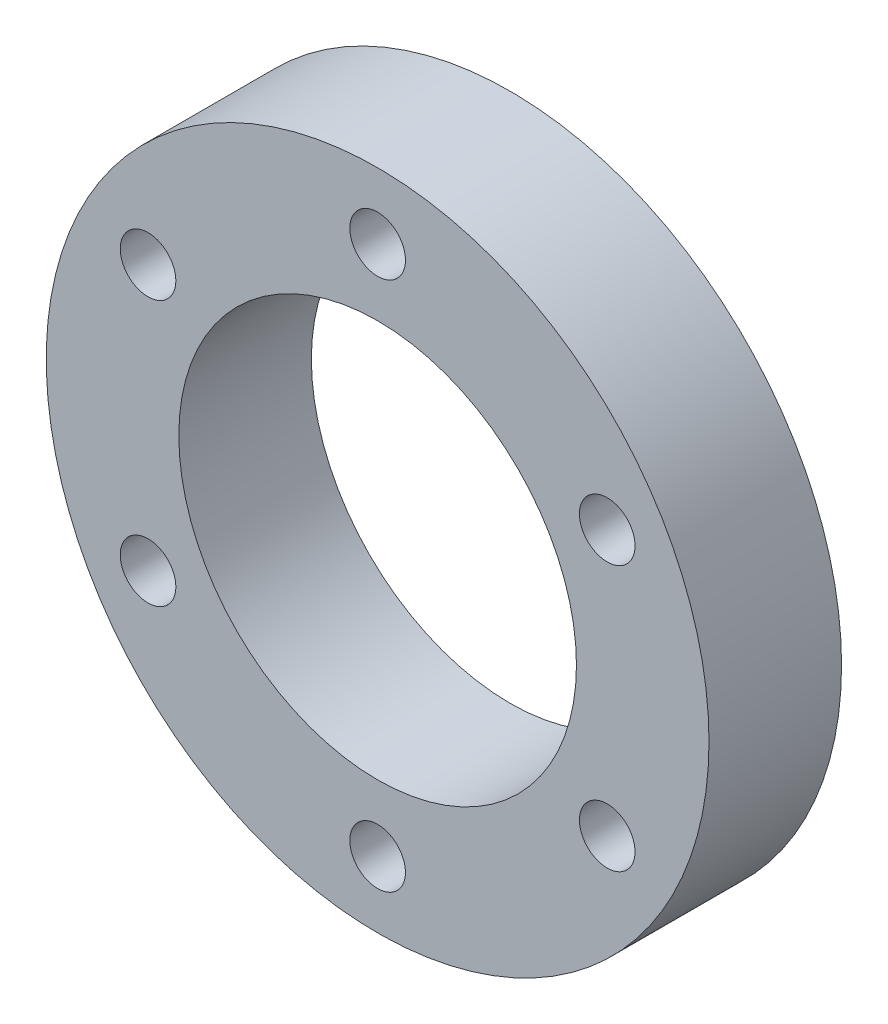
ISO-10303-21;
HEADER;
FILE_DESCRIPTION(('STEP AP214'),'2;1');
FILE_NAME('part.step','',(''),(''),'','','');
FILE_SCHEMA(('AUTOMOTIVE_DESIGN { 1 0 10303 214 1 1 1 1 }'));
ENDSEC;
DATA;
#1=APPLICATION_CONTEXT('core data for automotive mechanical design processes');
#2=APPLICATION_PROTOCOL_DEFINITION('international standard','automotive_design',2000,#1);
#3=PRODUCT_CONTEXT('',#1,'mechanical');
#4=PRODUCT('Part','Part','',(#3));
#5=PRODUCT_RELATED_PRODUCT_CATEGORY('part','',(#4));
#6=PRODUCT_DEFINITION_FORMATION('','',#4);
#7=PRODUCT_DEFINITION_CONTEXT('part definition',#1,'design');
#8=PRODUCT_DEFINITION('design','',#6,#7);
#9=PRODUCT_DEFINITION_SHAPE('','',#8);
#10=(LENGTH_UNIT() NAMED_UNIT(*) SI_UNIT(.MILLI.,.METRE.));
#11=(NAMED_UNIT(*) PLANE_ANGLE_UNIT() SI_UNIT($,.RADIAN.));
#12=(NAMED_UNIT(*) SI_UNIT($,.STERADIAN.) SOLID_ANGLE_UNIT());
#13=UNCERTAINTY_MEASURE_WITH_UNIT(LENGTH_MEASURE(1.E-05),#10,'distance_accuracy_value','');
#14=(GEOMETRIC_REPRESENTATION_CONTEXT(3) GLOBAL_UNCERTAINTY_ASSIGNED_CONTEXT((#13)) GLOBAL_UNIT_ASSIGNED_CONTEXT((#10,
#11,#12)) REPRESENTATION_CONTEXT('',''));
#15=CARTESIAN_POINT('',(0.,0.,0.));
#16=DIRECTION('',(0.,0.,1.));
#17=DIRECTION('',(1.,0.,0.));
#18=AXIS2_PLACEMENT_3D('',#15,#16,#17);
#19=CARTESIAN_POINT('',(0.,0.,12.7));
#20=DIRECTION('',(0.,0.,1.));
#21=DIRECTION('',(1.,0.,0.));
#22=AXIS2_PLACEMENT_3D('',#19,#20,#21);
#23=PLANE('',#22);
#24=CARTESIAN_POINT('',(0.,25.4,12.7));
#25=DIRECTION('',(0.,0.,1.));
#26=DIRECTION('',(1.,0.,0.));
#27=AXIS2_PLACEMENT_3D('',#24,#25,#26);
#28=CIRCLE('',#27,2.665);
#29=CARTESIAN_POINT('',(2.665,25.4,12.7));
#30=VERTEX_POINT('',#29);
#31=EDGE_CURVE('E73',#30,#30,#28,.T.);
#32=ORIENTED_EDGE('',*,*,#31,.F.);
#33=EDGE_LOOP('',(#32));
#34=FACE_BOUND('',#33,.T.);
#35=CARTESIAN_POINT('',(-21.9970452561242,12.6999999999991,12.7));
#36=DIRECTION('',(0.,0.,1.));
#37=DIRECTION('',(1.,0.,0.));
#38=AXIS2_PLACEMENT_3D('',#35,#36,#37);
#39=CIRCLE('',#38,2.66500000000108);
#40=CARTESIAN_POINT('',(-19.3320452561231,12.6999999999991,12.7));
#41=VERTEX_POINT('',#40);
#42=EDGE_CURVE('E96',#41,#41,#39,.T.);
#43=ORIENTED_EDGE('',*,*,#42,.F.);
#44=EDGE_LOOP('',(#43));
#45=FACE_BOUND('',#44,.T.);
#46=CARTESIAN_POINT('',(2.12642958161792E-12,-25.4,12.7));
#47=DIRECTION('',(0.,0.,1.));
#48=DIRECTION('',(1.,0.,0.));
#49=AXIS2_PLACEMENT_3D('',#46,#47,#48);
#50=CIRCLE('',#49,2.6650000000022);
#51=CARTESIAN_POINT('',(2.66500000000433,-25.4,12.7));
#52=VERTEX_POINT('',#51);
#53=EDGE_CURVE('E64',#52,#52,#50,.T.);
#54=ORIENTED_EDGE('',*,*,#53,.F.);
#55=EDGE_LOOP('',(#54));
#56=FACE_BOUND('',#55,.T.);
#57=CARTESIAN_POINT('',(21.997045256125,12.7000000000015,12.7));
#58=DIRECTION('',(0.,0.,1.));
#59=DIRECTION('',(1.,0.,0.));
#60=AXIS2_PLACEMENT_3D('',#57,#58,#59);
#61=CIRCLE('',#60,2.665);
#62=CARTESIAN_POINT('',(24.662045256125,12.7000000000015,12.7));
#63=VERTEX_POINT('',#62);
#64=EDGE_CURVE('E65',#63,#63,#61,.T.);
#65=ORIENTED_EDGE('',*,*,#64,.F.);
#66=EDGE_LOOP('',(#65));
#67=FACE_BOUND('',#66,.T.);
#68=CARTESIAN_POINT('',(21.9970452561263,-12.6999999999991,12.7));
#69=DIRECTION('',(0.,0.,1.));
#70=DIRECTION('',(1.,0.,0.));
#71=AXIS2_PLACEMENT_3D('',#68,#69,#70);
#72=CIRCLE('',#71,2.66500000000177);
#73=CARTESIAN_POINT('',(24.6620452561281,-12.6999999999991,12.7));
#74=VERTEX_POINT('',#73);
#75=EDGE_CURVE('E81',#74,#74,#72,.T.);
#76=ORIENTED_EDGE('',*,*,#75,.F.);
#77=EDGE_LOOP('',(#76));
#78=FACE_BOUND('',#77,.T.);
#79=CARTESIAN_POINT('',(-21.9970452561231,-12.7000000000009,12.7));
#80=DIRECTION('',(0.,0.,1.));
#81=DIRECTION('',(1.,0.,0.));
#82=AXIS2_PLACEMENT_3D('',#79,#80,#81);
#83=CIRCLE('',#82,2.66500000000203);
#84=CARTESIAN_POINT('',(-19.3320452561211,-12.7000000000009,12.7));
#85=VERTEX_POINT('',#84);
#86=EDGE_CURVE('E82',#85,#85,#83,.T.);
#87=ORIENTED_EDGE('',*,*,#86,.F.);
#88=EDGE_LOOP('',(#87));
#89=FACE_BOUND('',#88,.T.);
#90=CARTESIAN_POINT('',(0.,0.,12.7));
#91=DIRECTION('',(0.,0.,1.));
#92=DIRECTION('',(1.,0.,0.));
#93=AXIS2_PLACEMENT_3D('',#90,#91,#92);
#94=CIRCLE('',#93,31.75);
#95=CARTESIAN_POINT('',(31.75,0.,12.7));
#96=VERTEX_POINT('',#95);
#97=EDGE_CURVE('E10',#96,#96,#94,.T.);
#98=ORIENTED_EDGE('',*,*,#97,.T.);
#99=EDGE_LOOP('',(#98));
#100=FACE_BOUND('',#99,.T.);
#101=CARTESIAN_POINT('',(0.,0.,12.7));
#102=DIRECTION('',(0.,0.,1.));
#103=DIRECTION('',(1.,0.,0.));
#104=AXIS2_PLACEMENT_3D('',#101,#102,#103);
#105=CIRCLE('',#104,19.05);
#106=CARTESIAN_POINT('',(19.05,0.,12.7));
#107=VERTEX_POINT('',#106);
#108=EDGE_CURVE('E50',#107,#107,#105,.T.);
#109=ORIENTED_EDGE('',*,*,#108,.F.);
#110=EDGE_LOOP('',(#109));
#111=FACE_BOUND('',#110,.T.);
#112=ADVANCED_FACE('F36',(#34,#45,#56,#67,#78,#89,#100,#111),#23,.T.);
#113=CARTESIAN_POINT('',(0.,0.,0.));
#114=DIRECTION('',(0.,0.,1.));
#115=DIRECTION('',(1.,0.,0.));
#116=AXIS2_PLACEMENT_3D('',#113,#114,#115);
#117=PLANE('',#116);
#118=CARTESIAN_POINT('',(0.,25.4,0.));
#119=DIRECTION('',(0.,0.,1.));
#120=DIRECTION('',(1.,0.,0.));
#121=AXIS2_PLACEMENT_3D('',#118,#119,#120);
#122=CIRCLE('',#121,2.665);
#123=CARTESIAN_POINT('',(2.665,25.4,0.));
#124=VERTEX_POINT('',#123);
#125=EDGE_CURVE('E56',#124,#124,#122,.F.);
#126=ORIENTED_EDGE('',*,*,#125,.F.);
#127=EDGE_LOOP('',(#126));
#128=FACE_BOUND('',#127,.T.);
#129=CARTESIAN_POINT('',(-21.9970452561242,12.6999999999991,0.));
#130=DIRECTION('',(0.,0.,1.));
#131=DIRECTION('',(1.,0.,0.));
#132=AXIS2_PLACEMENT_3D('',#129,#130,#131);
#133=CIRCLE('',#132,2.66500000000108);
#134=CARTESIAN_POINT('',(-19.3320452561231,12.6999999999991,0.));
#135=VERTEX_POINT('',#134);
#136=EDGE_CURVE('E86',#135,#135,#133,.F.);
#137=ORIENTED_EDGE('',*,*,#136,.F.);
#138=EDGE_LOOP('',(#137));
#139=FACE_BOUND('',#138,.T.);
#140=CARTESIAN_POINT('',(2.12642958161792E-12,-25.4,0.));
#141=DIRECTION('',(0.,0.,1.));
#142=DIRECTION('',(1.,0.,0.));
#143=AXIS2_PLACEMENT_3D('',#140,#141,#142);
#144=CIRCLE('',#143,2.6650000000022);
#145=CARTESIAN_POINT('',(2.66500000000433,-25.4,0.));
#146=VERTEX_POINT('',#145);
#147=EDGE_CURVE('E69',#146,#146,#144,.F.);
#148=ORIENTED_EDGE('',*,*,#147,.F.);
#149=EDGE_LOOP('',(#148));
#150=FACE_BOUND('',#149,.T.);
#151=CARTESIAN_POINT('',(21.997045256125,12.7000000000015,0.));
#152=DIRECTION('',(0.,0.,1.));
#153=DIRECTION('',(1.,0.,0.));
#154=AXIS2_PLACEMENT_3D('',#151,#152,#153);
#155=CIRCLE('',#154,2.665);
#156=CARTESIAN_POINT('',(24.662045256125,12.7000000000015,0.));
#157=VERTEX_POINT('',#156);
#158=EDGE_CURVE('E60',#157,#157,#155,.F.);
#159=ORIENTED_EDGE('',*,*,#158,.F.);
#160=EDGE_LOOP('',(#159));
#161=FACE_BOUND('',#160,.T.);
#162=CARTESIAN_POINT('',(21.9970452561263,-12.6999999999991,0.));
#163=DIRECTION('',(0.,0.,1.));
#164=DIRECTION('',(1.,0.,0.));
#165=AXIS2_PLACEMENT_3D('',#162,#163,#164);
#166=CIRCLE('',#165,2.66500000000177);
#167=CARTESIAN_POINT('',(24.6620452561281,-12.6999999999991,0.));
#168=VERTEX_POINT('',#167);
#169=EDGE_CURVE('E68',#168,#168,#166,.F.);
#170=ORIENTED_EDGE('',*,*,#169,.F.);
#171=EDGE_LOOP('',(#170));
#172=FACE_BOUND('',#171,.T.);
#173=CARTESIAN_POINT('',(-21.9970452561231,-12.7000000000009,0.));
#174=DIRECTION('',(0.,0.,1.));
#175=DIRECTION('',(1.,0.,0.));
#176=AXIS2_PLACEMENT_3D('',#173,#174,#175);
#177=CIRCLE('',#176,2.66500000000203);
#178=CARTESIAN_POINT('',(-19.3320452561211,-12.7000000000009,0.));
#179=VERTEX_POINT('',#178);
#180=EDGE_CURVE('E77',#179,#179,#177,.F.);
#181=ORIENTED_EDGE('',*,*,#180,.F.);
#182=EDGE_LOOP('',(#181));
#183=FACE_BOUND('',#182,.T.);
#184=CARTESIAN_POINT('',(0.,0.,0.));
#185=DIRECTION('',(0.,0.,1.));
#186=DIRECTION('',(1.,0.,0.));
#187=AXIS2_PLACEMENT_3D('',#184,#185,#186);
#188=CIRCLE('',#187,31.75);
#189=CARTESIAN_POINT('',(31.75,0.,0.));
#190=VERTEX_POINT('',#189);
#191=EDGE_CURVE('E40',#190,#190,#188,.T.);
#192=ORIENTED_EDGE('',*,*,#191,.F.);
#193=EDGE_LOOP('',(#192));
#194=FACE_BOUND('',#193,.T.);
#195=CARTESIAN_POINT('',(0.,0.,0.));
#196=DIRECTION('',(0.,0.,1.));
#197=DIRECTION('',(1.,0.,0.));
#198=AXIS2_PLACEMENT_3D('',#195,#196,#197);
#199=CIRCLE('',#198,19.05);
#200=CARTESIAN_POINT('',(19.05,0.,0.));
#201=VERTEX_POINT('',#200);
#202=EDGE_CURVE('E52',#201,#201,#199,.T.);
#203=ORIENTED_EDGE('',*,*,#202,.T.);
#204=EDGE_LOOP('',(#203));
#205=FACE_BOUND('',#204,.T.);
#206=ADVANCED_FACE('F112',(#128,#139,#150,#161,#172,#183,#194,#205),#117,.F.);
#207=CARTESIAN_POINT('',(0.,0.,12.7));
#208=DIRECTION('',(0.,0.,-1.));
#209=DIRECTION('',(-1.,0.,0.));
#210=AXIS2_PLACEMENT_3D('',#207,#208,#209);
#211=CYLINDRICAL_SURFACE('',#210,31.75);
#212=ORIENTED_EDGE('',*,*,#97,.F.);
#213=EDGE_LOOP('',(#212));
#214=FACE_BOUND('',#213,.T.);
#215=ORIENTED_EDGE('',*,*,#191,.T.);
#216=EDGE_LOOP('',(#215));
#217=FACE_BOUND('',#216,.T.);
#218=ADVANCED_FACE('F38',(#214,#217),#211,.T.);
#219=CARTESIAN_POINT('',(0.,0.,12.7));
#220=DIRECTION('',(0.,0.,-1.));
#221=DIRECTION('',(-1.,0.,0.));
#222=AXIS2_PLACEMENT_3D('',#219,#220,#221);
#223=CYLINDRICAL_SURFACE('',#222,19.05);
#224=ORIENTED_EDGE('',*,*,#108,.T.);
#225=EDGE_LOOP('',(#224));
#226=FACE_BOUND('',#225,.T.);
#227=ORIENTED_EDGE('',*,*,#202,.F.);
#228=EDGE_LOOP('',(#227));
#229=FACE_BOUND('',#228,.T.);
#230=ADVANCED_FACE('F126',(#226,#229),#223,.F.);
#231=CARTESIAN_POINT('',(-21.9970452561231,-12.7000000000009,-0.000999999999999265));
#232=DIRECTION('',(0.,0.,1.));
#233=DIRECTION('',(1.,0.,0.));
#234=AXIS2_PLACEMENT_3D('',#231,#232,#233);
#235=CYLINDRICAL_SURFACE('',#234,2.66500000000203);
#236=ORIENTED_EDGE('',*,*,#86,.T.);
#237=EDGE_LOOP('',(#236));
#238=FACE_BOUND('',#237,.T.);
#239=ORIENTED_EDGE('',*,*,#180,.T.);
#240=EDGE_LOOP('',(#239));
#241=FACE_BOUND('',#240,.T.);
#242=ADVANCED_FACE('F129',(#238,#241),#235,.F.);
#243=CARTESIAN_POINT('',(21.9970452561263,-12.6999999999991,-0.000999999999999265));
#244=DIRECTION('',(0.,0.,1.));
#245=DIRECTION('',(1.,0.,0.));
#246=AXIS2_PLACEMENT_3D('',#243,#244,#245);
#247=CYLINDRICAL_SURFACE('',#246,2.66500000000177);
#248=ORIENTED_EDGE('',*,*,#75,.T.);
#249=EDGE_LOOP('',(#248));
#250=FACE_BOUND('',#249,.T.);
#251=ORIENTED_EDGE('',*,*,#169,.T.);
#252=EDGE_LOOP('',(#251));
#253=FACE_BOUND('',#252,.T.);
#254=ADVANCED_FACE('F146',(#250,#253),#247,.F.);
#255=CARTESIAN_POINT('',(21.997045256125,12.7000000000015,-0.000999999999999265));
#256=DIRECTION('',(0.,0.,1.));
#257=DIRECTION('',(1.,0.,0.));
#258=AXIS2_PLACEMENT_3D('',#255,#256,#257);
#259=CYLINDRICAL_SURFACE('',#258,2.665);
#260=ORIENTED_EDGE('',*,*,#64,.T.);
#261=EDGE_LOOP('',(#260));
#262=FACE_BOUND('',#261,.T.);
#263=ORIENTED_EDGE('',*,*,#158,.T.);
#264=EDGE_LOOP('',(#263));
#265=FACE_BOUND('',#264,.T.);
#266=ADVANCED_FACE('F142',(#262,#265),#259,.F.);
#267=CARTESIAN_POINT('',(2.12642958161792E-12,-25.4,-0.000999999999999265));
#268=DIRECTION('',(0.,0.,1.));
#269=DIRECTION('',(1.,0.,0.));
#270=AXIS2_PLACEMENT_3D('',#267,#268,#269);
#271=CYLINDRICAL_SURFACE('',#270,2.6650000000022);
#272=ORIENTED_EDGE('',*,*,#53,.T.);
#273=EDGE_LOOP('',(#272));
#274=FACE_BOUND('',#273,.T.);
#275=ORIENTED_EDGE('',*,*,#147,.T.);
#276=EDGE_LOOP('',(#275));
#277=FACE_BOUND('',#276,.T.);
#278=ADVANCED_FACE('F145',(#274,#277),#271,.F.);
#279=CARTESIAN_POINT('',(-21.9970452561242,12.6999999999991,-0.000999999999999265));
#280=DIRECTION('',(0.,0.,1.));
#281=DIRECTION('',(1.,0.,0.));
#282=AXIS2_PLACEMENT_3D('',#279,#280,#281);
#283=CYLINDRICAL_SURFACE('',#282,2.66500000000108);
#284=ORIENTED_EDGE('',*,*,#42,.T.);
#285=EDGE_LOOP('',(#284));
#286=FACE_BOUND('',#285,.T.);
#287=ORIENTED_EDGE('',*,*,#136,.T.);
#288=EDGE_LOOP('',(#287));
#289=FACE_BOUND('',#288,.T.);
#290=ADVANCED_FACE('F150',(#286,#289),#283,.F.);
#291=CARTESIAN_POINT('',(0.,25.4,-0.000999999999999265));
#292=DIRECTION('',(0.,0.,1.));
#293=DIRECTION('',(1.,0.,0.));
#294=AXIS2_PLACEMENT_3D('',#291,#292,#293);
#295=CYLINDRICAL_SURFACE('',#294,2.665);
#296=ORIENTED_EDGE('',*,*,#31,.T.);
#297=EDGE_LOOP('',(#296));
#298=FACE_BOUND('',#297,.T.);
#299=ORIENTED_EDGE('',*,*,#125,.T.);
#300=EDGE_LOOP('',(#299));
#301=FACE_BOUND('',#300,.T.);
#302=ADVANCED_FACE('F107',(#298,#301),#295,.F.);
#303=CLOSED_SHELL('',(#112,#206,#218,#230,#242,#254,#266,#278,#290,#302));
#304=MANIFOLD_SOLID_BREP('B2',#303);
#305=ADVANCED_BREP_SHAPE_REPRESENTATION('',(#18,#304),#14);
#306=SHAPE_DEFINITION_REPRESENTATION(#9,#305);
ENDSEC;
END-ISO-10303-21;
